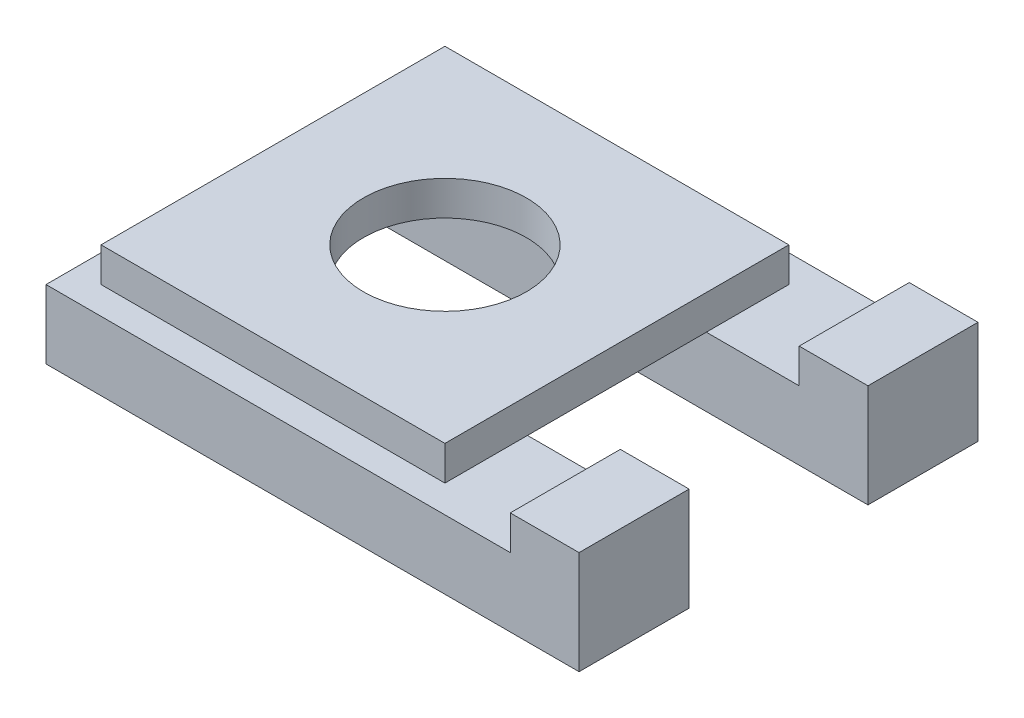
ISO-10303-21;
HEADER;
FILE_DESCRIPTION(('STEP AP214'),'2;1');
FILE_NAME('part.step','',(''),(''),'','','');
FILE_SCHEMA(('AUTOMOTIVE_DESIGN { 1 0 10303 214 1 1 1 1 }'));
ENDSEC;
DATA;
#1=APPLICATION_CONTEXT('core data for automotive mechanical design processes');
#2=APPLICATION_PROTOCOL_DEFINITION('international standard','automotive_design',2000,#1);
#3=PRODUCT_CONTEXT('',#1,'mechanical');
#4=PRODUCT('Part','Part','',(#3));
#5=PRODUCT_RELATED_PRODUCT_CATEGORY('part','',(#4));
#6=PRODUCT_DEFINITION_FORMATION('','',#4);
#7=PRODUCT_DEFINITION_CONTEXT('part definition',#1,'design');
#8=PRODUCT_DEFINITION('design','',#6,#7);
#9=PRODUCT_DEFINITION_SHAPE('','',#8);
#10=(LENGTH_UNIT() NAMED_UNIT(*) SI_UNIT(.MILLI.,.METRE.));
#11=(NAMED_UNIT(*) PLANE_ANGLE_UNIT() SI_UNIT($,.RADIAN.));
#12=(NAMED_UNIT(*) SI_UNIT($,.STERADIAN.) SOLID_ANGLE_UNIT());
#13=UNCERTAINTY_MEASURE_WITH_UNIT(LENGTH_MEASURE(1.E-05),#10,'distance_accuracy_value','');
#14=(GEOMETRIC_REPRESENTATION_CONTEXT(3) GLOBAL_UNCERTAINTY_ASSIGNED_CONTEXT((#13)) GLOBAL_UNIT_ASSIGNED_CONTEXT((#10,
#11,#12)) REPRESENTATION_CONTEXT('',''));
#15=CARTESIAN_POINT('',(0.,0.,0.));
#16=DIRECTION('',(0.,0.,1.));
#17=DIRECTION('',(1.,0.,0.));
#18=AXIS2_PLACEMENT_3D('',#15,#16,#17);
#19=CARTESIAN_POINT('',(0.,0.,0.));
#20=DIRECTION('',(0.,-1.,0.));
#21=DIRECTION('',(0.,0.,-1.));
#22=AXIS2_PLACEMENT_3D('',#19,#20,#21);
#23=PLANE('',#22);
#24=DIRECTION('',(1.,0.,0.));
#25=VECTOR('',#24,1.);
#26=CARTESIAN_POINT('',(0.,0.,26.));
#27=LINE('',#26,#25);
#28=CARTESIAN_POINT('',(-50.,0.,26.));
#29=VERTEX_POINT('',#28);
#30=CARTESIAN_POINT('',(50.,0.,26.));
#31=VERTEX_POINT('',#30);
#32=EDGE_CURVE('E11',#29,#31,#27,.T.);
#33=ORIENTED_EDGE('',*,*,#32,.F.);
#34=DIRECTION('',(0.,0.,1.));
#35=VECTOR('',#34,1.);
#36=CARTESIAN_POINT('',(-50.,0.,50.));
#37=LINE('',#36,#35);
#38=CARTESIAN_POINT('',(-50.,0.,-26.));
#39=VERTEX_POINT('',#38);
#40=EDGE_CURVE('E302',#39,#29,#37,.T.);
#41=ORIENTED_EDGE('',*,*,#40,.F.);
#42=DIRECTION('',(1.,0.,0.));
#43=VECTOR('',#42,1.);
#44=CARTESIAN_POINT('',(0.,0.,-26.));
#45=LINE('',#44,#43);
#46=CARTESIAN_POINT('',(50.,0.,-26.));
#47=VERTEX_POINT('',#46);
#48=EDGE_CURVE('E48',#39,#47,#45,.T.);
#49=ORIENTED_EDGE('',*,*,#48,.T.);
#50=DIRECTION('',(0.,0.,-1.));
#51=VECTOR('',#50,1.);
#52=CARTESIAN_POINT('',(50.,0.,50.));
#53=LINE('',#52,#51);
#54=EDGE_CURVE('E294',#31,#47,#53,.T.);
#55=ORIENTED_EDGE('',*,*,#54,.F.);
#56=EDGE_LOOP('',(#33,#41,#49,#55));
#57=FACE_BOUND('',#56,.T.);
#58=CARTESIAN_POINT('',(0.,0.,0.));
#59=DIRECTION('',(0.,1.,0.));
#60=DIRECTION('',(0.,0.,1.));
#61=AXIS2_PLACEMENT_3D('',#58,#59,#60);
#62=CIRCLE('',#61,23.6820870143645);
#63=CARTESIAN_POINT('',(0.,0.,23.6820870143645));
#64=VERTEX_POINT('',#63);
#65=EDGE_CURVE('E260',#64,#64,#62,.T.);
#66=ORIENTED_EDGE('',*,*,#65,.T.);
#67=EDGE_LOOP('',(#66));
#68=FACE_BOUND('',#67,.T.);
#69=ADVANCED_FACE('F39',(#57,#68),#23,.T.);
#70=CARTESIAN_POINT('',(0.,10.,0.));
#71=DIRECTION('',(0.,-1.,0.));
#72=DIRECTION('',(0.,0.,-1.));
#73=AXIS2_PLACEMENT_3D('',#70,#71,#72);
#74=PLANE('',#73);
#75=DIRECTION('',(0.,0.,-1.));
#76=VECTOR('',#75,1.);
#77=CARTESIAN_POINT('',(50.,10.,50.));
#78=LINE('',#77,#76);
#79=CARTESIAN_POINT('',(50.,10.,50.));
#80=VERTEX_POINT('',#79);
#81=CARTESIAN_POINT('',(50.,10.,-50.));
#82=VERTEX_POINT('',#81);
#83=EDGE_CURVE('E278',#80,#82,#78,.T.);
#84=ORIENTED_EDGE('',*,*,#83,.T.);
#85=DIRECTION('',(-1.,0.,0.));
#86=VECTOR('',#85,1.);
#87=CARTESIAN_POINT('',(-50.,10.,-50.));
#88=LINE('',#87,#86);
#89=CARTESIAN_POINT('',(-50.,10.,-50.));
#90=VERTEX_POINT('',#89);
#91=EDGE_CURVE('E284',#82,#90,#88,.T.);
#92=ORIENTED_EDGE('',*,*,#91,.T.);
#93=DIRECTION('',(0.,0.,1.));
#94=VECTOR('',#93,1.);
#95=CARTESIAN_POINT('',(-50.,10.,50.));
#96=LINE('',#95,#94);
#97=CARTESIAN_POINT('',(-50.,10.,50.));
#98=VERTEX_POINT('',#97);
#99=EDGE_CURVE('E287',#90,#98,#96,.T.);
#100=ORIENTED_EDGE('',*,*,#99,.T.);
#101=DIRECTION('',(1.,0.,0.));
#102=VECTOR('',#101,1.);
#103=CARTESIAN_POINT('',(-50.,10.,50.));
#104=LINE('',#103,#102);
#105=EDGE_CURVE('E289',#98,#80,#104,.T.);
#106=ORIENTED_EDGE('',*,*,#105,.T.);
#107=EDGE_LOOP('',(#84,#92,#100,#106));
#108=FACE_BOUND('',#107,.T.);
#109=CARTESIAN_POINT('',(0.,10.,0.));
#110=DIRECTION('',(0.,1.,0.));
#111=DIRECTION('',(0.,0.,1.));
#112=AXIS2_PLACEMENT_3D('',#109,#110,#111);
#113=CIRCLE('',#112,23.6820870143645);
#114=CARTESIAN_POINT('',(0.,10.,23.6820870143645));
#115=VERTEX_POINT('',#114);
#116=EDGE_CURVE('E273',#115,#115,#113,.T.);
#117=ORIENTED_EDGE('',*,*,#116,.F.);
#118=EDGE_LOOP('',(#117));
#119=FACE_BOUND('',#118,.T.);
#120=ADVANCED_FACE('F340',(#108,#119),#74,.F.);
#121=CARTESIAN_POINT('',(50.,10.,50.));
#122=DIRECTION('',(-1.,0.,0.));
#123=DIRECTION('',(0.,0.,1.));
#124=AXIS2_PLACEMENT_3D('',#121,#122,#123);
#125=PLANE('',#124);
#126=CARTESIAN_POINT('',(50.,0.,50.));
#127=VERTEX_POINT('',#126);
#128=EDGE_CURVE('E292',#127,#31,#53,.T.);
#129=ORIENTED_EDGE('',*,*,#128,.T.);
#130=ORIENTED_EDGE('',*,*,#54,.T.);
#131=CARTESIAN_POINT('',(50.,0.,-50.));
#132=VERTEX_POINT('',#131);
#133=EDGE_CURVE('E280',#47,#132,#53,.T.);
#134=ORIENTED_EDGE('',*,*,#133,.T.);
#135=DIRECTION('',(0.,-1.,0.));
#136=VECTOR('',#135,1.);
#137=CARTESIAN_POINT('',(50.,10.,-50.));
#138=LINE('',#137,#136);
#139=EDGE_CURVE('E43',#82,#132,#138,.T.);
#140=ORIENTED_EDGE('',*,*,#139,.F.);
#141=ORIENTED_EDGE('',*,*,#83,.F.);
#142=DIRECTION('',(0.,-1.,0.));
#143=VECTOR('',#142,1.);
#144=CARTESIAN_POINT('',(50.,10.,50.));
#145=LINE('',#144,#143);
#146=EDGE_CURVE('E288',#80,#127,#145,.T.);
#147=ORIENTED_EDGE('',*,*,#146,.T.);
#148=EDGE_LOOP('',(#129,#130,#134,#140,#141,#147));
#149=FACE_BOUND('',#148,.T.);
#150=ADVANCED_FACE('F41',(#149),#125,.F.);
#151=CARTESIAN_POINT('',(-50.,10.,-50.));
#152=DIRECTION('',(0.,0.,1.));
#153=DIRECTION('',(1.,0.,0.));
#154=AXIS2_PLACEMENT_3D('',#151,#152,#153);
#155=PLANE('',#154);
#156=DIRECTION('',(-1.,0.,0.));
#157=VECTOR('',#156,1.);
#158=CARTESIAN_POINT('',(-50.,0.,-50.));
#159=LINE('',#158,#157);
#160=CARTESIAN_POINT('',(-50.,0.,-50.));
#161=VERTEX_POINT('',#160);
#162=EDGE_CURVE('E291',#132,#161,#159,.T.);
#163=ORIENTED_EDGE('',*,*,#162,.T.);
#164=DIRECTION('',(0.,-1.,0.));
#165=VECTOR('',#164,1.);
#166=CARTESIAN_POINT('',(-50.,10.,-50.));
#167=LINE('',#166,#165);
#168=EDGE_CURVE('E307',#90,#161,#167,.T.);
#169=ORIENTED_EDGE('',*,*,#168,.F.);
#170=ORIENTED_EDGE('',*,*,#91,.F.);
#171=ORIENTED_EDGE('',*,*,#139,.T.);
#172=EDGE_LOOP('',(#163,#169,#170,#171));
#173=FACE_BOUND('',#172,.T.);
#174=ADVANCED_FACE('F357',(#173),#155,.F.);
#175=CARTESIAN_POINT('',(-50.,10.,50.));
#176=DIRECTION('',(1.,0.,0.));
#177=DIRECTION('',(0.,0.,-1.));
#178=AXIS2_PLACEMENT_3D('',#175,#176,#177);
#179=PLANE('',#178);
#180=EDGE_CURVE('E299',#161,#39,#37,.T.);
#181=ORIENTED_EDGE('',*,*,#180,.T.);
#182=ORIENTED_EDGE('',*,*,#40,.T.);
#183=CARTESIAN_POINT('',(-50.,0.,50.));
#184=VERTEX_POINT('',#183);
#185=EDGE_CURVE('E300',#29,#184,#37,.T.);
#186=ORIENTED_EDGE('',*,*,#185,.T.);
#187=DIRECTION('',(0.,-1.,0.));
#188=VECTOR('',#187,1.);
#189=CARTESIAN_POINT('',(-50.,10.,50.));
#190=LINE('',#189,#188);
#191=EDGE_CURVE('E303',#98,#184,#190,.T.);
#192=ORIENTED_EDGE('',*,*,#191,.F.);
#193=ORIENTED_EDGE('',*,*,#99,.F.);
#194=ORIENTED_EDGE('',*,*,#168,.T.);
#195=EDGE_LOOP('',(#181,#182,#186,#192,#193,#194));
#196=FACE_BOUND('',#195,.T.);
#197=ADVANCED_FACE('F354',(#196),#179,.F.);
#198=CARTESIAN_POINT('',(-50.,10.,50.));
#199=DIRECTION('',(0.,0.,-1.));
#200=DIRECTION('',(-1.,0.,0.));
#201=AXIS2_PLACEMENT_3D('',#198,#199,#200);
#202=PLANE('',#201);
#203=DIRECTION('',(1.,0.,0.));
#204=VECTOR('',#203,1.);
#205=CARTESIAN_POINT('',(-50.,0.,50.));
#206=LINE('',#205,#204);
#207=EDGE_CURVE('E281',#184,#127,#206,.T.);
#208=ORIENTED_EDGE('',*,*,#207,.T.);
#209=ORIENTED_EDGE('',*,*,#146,.F.);
#210=ORIENTED_EDGE('',*,*,#105,.F.);
#211=ORIENTED_EDGE('',*,*,#191,.T.);
#212=EDGE_LOOP('',(#208,#209,#210,#211));
#213=FACE_BOUND('',#212,.T.);
#214=ADVANCED_FACE('F349',(#213),#202,.F.);
#215=CARTESIAN_POINT('',(0.,10.,0.));
#216=DIRECTION('',(0.,-1.,0.));
#217=DIRECTION('',(0.,0.,-1.));
#218=AXIS2_PLACEMENT_3D('',#215,#216,#217);
#219=CYLINDRICAL_SURFACE('',#218,23.6820870143645);
#220=ORIENTED_EDGE('',*,*,#116,.T.);
#221=EDGE_LOOP('',(#220));
#222=FACE_BOUND('',#221,.T.);
#223=ORIENTED_EDGE('',*,*,#65,.F.);
#224=EDGE_LOOP('',(#223));
#225=FACE_BOUND('',#224,.T.);
#226=ADVANCED_FACE('F355',(#222,#225),#219,.F.);
#227=CARTESIAN_POINT('',(0.,-20.,-26.));
#228=DIRECTION('',(0.,0.,1.));
#229=DIRECTION('',(1.,0.,0.));
#230=AXIS2_PLACEMENT_3D('',#227,#228,#229);
#231=PLANE('',#230);
#232=CARTESIAN_POINT('',(-58.,0.,-26.));
#233=VERTEX_POINT('',#232);
#234=EDGE_CURVE('E265',#233,#39,#45,.T.);
#235=ORIENTED_EDGE('',*,*,#234,.F.);
#236=DIRECTION('',(0.,1.,0.));
#237=VECTOR('',#236,1.);
#238=CARTESIAN_POINT('',(-58.,-20.,-26.));
#239=LINE('',#238,#237);
#240=CARTESIAN_POINT('',(-58.,-20.,-26.));
#241=VERTEX_POINT('',#240);
#242=EDGE_CURVE('E243',#241,#233,#239,.T.);
#243=ORIENTED_EDGE('',*,*,#242,.F.);
#244=DIRECTION('',(1.,0.,0.));
#245=VECTOR('',#244,1.);
#246=CARTESIAN_POINT('',(0.,-20.,-26.));
#247=LINE('',#246,#245);
#248=CARTESIAN_POINT('',(97.,-20.,-26.));
#249=VERTEX_POINT('',#248);
#250=EDGE_CURVE('E256',#241,#249,#247,.T.);
#251=ORIENTED_EDGE('',*,*,#250,.T.);
#252=DIRECTION('',(0.,-1.,0.));
#253=VECTOR('',#252,1.);
#254=CARTESIAN_POINT('',(97.,10.,-26.));
#255=LINE('',#254,#253);
#256=CARTESIAN_POINT('',(97.,10.,-26.));
#257=VERTEX_POINT('',#256);
#258=EDGE_CURVE('E189',#257,#249,#255,.T.);
#259=ORIENTED_EDGE('',*,*,#258,.F.);
#260=DIRECTION('',(1.,0.,0.));
#261=VECTOR('',#260,1.);
#262=CARTESIAN_POINT('',(0.,10.,-26.));
#263=LINE('',#262,#261);
#264=CARTESIAN_POINT('',(77.,10.,-26.));
#265=VERTEX_POINT('',#264);
#266=EDGE_CURVE('E206',#265,#257,#263,.T.);
#267=ORIENTED_EDGE('',*,*,#266,.F.);
#268=DIRECTION('',(0.,-1.,0.));
#269=VECTOR('',#268,1.);
#270=CARTESIAN_POINT('',(77.,10.,-26.));
#271=LINE('',#270,#269);
#272=CARTESIAN_POINT('',(77.,0.,-26.));
#273=VERTEX_POINT('',#272);
#274=EDGE_CURVE('E208',#265,#273,#271,.T.);
#275=ORIENTED_EDGE('',*,*,#274,.T.);
#276=EDGE_CURVE('E61',#47,#273,#45,.T.);
#277=ORIENTED_EDGE('',*,*,#276,.F.);
#278=ORIENTED_EDGE('',*,*,#48,.F.);
#279=EDGE_LOOP('',(#235,#243,#251,#259,#267,#275,#277,#278));
#280=FACE_BOUND('',#279,.T.);
#281=ADVANCED_FACE('F330',(#280),#231,.T.);
#282=CARTESIAN_POINT('',(-58.,-20.,0.));
#283=DIRECTION('',(-1.,0.,0.));
#284=DIRECTION('',(0.,0.,1.));
#285=AXIS2_PLACEMENT_3D('',#282,#283,#284);
#286=PLANE('',#285);
#287=DIRECTION('',(0.,0.,1.));
#288=VECTOR('',#287,1.);
#289=CARTESIAN_POINT('',(-58.,0.,0.));
#290=LINE('',#289,#288);
#291=CARTESIAN_POINT('',(-58.,0.,-58.));
#292=VERTEX_POINT('',#291);
#293=EDGE_CURVE('E264',#292,#233,#290,.T.);
#294=ORIENTED_EDGE('',*,*,#293,.F.);
#295=DIRECTION('',(0.,1.,0.));
#296=VECTOR('',#295,1.);
#297=CARTESIAN_POINT('',(-58.,-20.,-58.));
#298=LINE('',#297,#296);
#299=CARTESIAN_POINT('',(-58.,-20.,-58.));
#300=VERTEX_POINT('',#299);
#301=EDGE_CURVE('E179',#300,#292,#298,.T.);
#302=ORIENTED_EDGE('',*,*,#301,.F.);
#303=DIRECTION('',(0.,0.,1.));
#304=VECTOR('',#303,1.);
#305=CARTESIAN_POINT('',(-58.,-20.,0.));
#306=LINE('',#305,#304);
#307=EDGE_CURVE('E177',#300,#241,#306,.T.);
#308=ORIENTED_EDGE('',*,*,#307,.T.);
#309=ORIENTED_EDGE('',*,*,#242,.T.);
#310=EDGE_LOOP('',(#294,#302,#308,#309));
#311=FACE_BOUND('',#310,.T.);
#312=ADVANCED_FACE('F384',(#311),#286,.T.);
#313=CARTESIAN_POINT('',(0.,-20.,-58.));
#314=DIRECTION('',(0.,0.,1.));
#315=DIRECTION('',(1.,0.,0.));
#316=AXIS2_PLACEMENT_3D('',#313,#314,#315);
#317=PLANE('',#316);
#318=DIRECTION('',(1.,0.,0.));
#319=VECTOR('',#318,1.);
#320=CARTESIAN_POINT('',(0.,0.,-58.));
#321=LINE('',#320,#319);
#322=CARTESIAN_POINT('',(77.,0.,-58.));
#323=VERTEX_POINT('',#322);
#324=EDGE_CURVE('E268',#292,#323,#321,.T.);
#325=ORIENTED_EDGE('',*,*,#324,.T.);
#326=DIRECTION('',(0.,-1.,0.));
#327=VECTOR('',#326,1.);
#328=CARTESIAN_POINT('',(77.,10.,-58.));
#329=LINE('',#328,#327);
#330=CARTESIAN_POINT('',(77.,10.,-58.));
#331=VERTEX_POINT('',#330);
#332=EDGE_CURVE('E186',#331,#323,#329,.T.);
#333=ORIENTED_EDGE('',*,*,#332,.F.);
#334=DIRECTION('',(1.,0.,0.));
#335=VECTOR('',#334,1.);
#336=CARTESIAN_POINT('',(0.,10.,-58.));
#337=LINE('',#336,#335);
#338=CARTESIAN_POINT('',(97.,10.,-58.));
#339=VERTEX_POINT('',#338);
#340=EDGE_CURVE('E184',#331,#339,#337,.T.);
#341=ORIENTED_EDGE('',*,*,#340,.T.);
#342=DIRECTION('',(0.,-1.,0.));
#343=VECTOR('',#342,1.);
#344=CARTESIAN_POINT('',(97.,10.,-58.));
#345=LINE('',#344,#343);
#346=CARTESIAN_POINT('',(97.,-20.,-58.));
#347=VERTEX_POINT('',#346);
#348=EDGE_CURVE('E182',#339,#347,#345,.T.);
#349=ORIENTED_EDGE('',*,*,#348,.T.);
#350=DIRECTION('',(1.,0.,0.));
#351=VECTOR('',#350,1.);
#352=CARTESIAN_POINT('',(0.,-20.,-58.));
#353=LINE('',#352,#351);
#354=EDGE_CURVE('E166',#300,#347,#353,.T.);
#355=ORIENTED_EDGE('',*,*,#354,.F.);
#356=ORIENTED_EDGE('',*,*,#301,.T.);
#357=EDGE_LOOP('',(#325,#333,#341,#349,#355,#356));
#358=FACE_BOUND('',#357,.T.);
#359=ADVANCED_FACE('F185',(#358),#317,.F.);
#360=CARTESIAN_POINT('',(0.,-20.,0.));
#361=DIRECTION('',(0.,-1.,0.));
#362=DIRECTION('',(0.,0.,-1.));
#363=AXIS2_PLACEMENT_3D('',#360,#361,#362);
#364=PLANE('',#363);
#365=ORIENTED_EDGE('',*,*,#250,.F.);
#366=ORIENTED_EDGE('',*,*,#307,.F.);
#367=ORIENTED_EDGE('',*,*,#354,.T.);
#368=DIRECTION('',(0.,0.,1.));
#369=VECTOR('',#368,1.);
#370=CARTESIAN_POINT('',(97.,-20.,0.));
#371=LINE('',#370,#369);
#372=EDGE_CURVE('E171',#347,#249,#371,.T.);
#373=ORIENTED_EDGE('',*,*,#372,.T.);
#374=EDGE_LOOP('',(#365,#366,#367,#373));
#375=FACE_BOUND('',#374,.T.);
#376=ADVANCED_FACE('F175',(#375),#364,.T.);
#377=CARTESIAN_POINT('',(0.,0.,0.));
#378=DIRECTION('',(0.,-1.,0.));
#379=DIRECTION('',(0.,0.,-1.));
#380=AXIS2_PLACEMENT_3D('',#377,#378,#379);
#381=PLANE('',#380);
#382=ORIENTED_EDGE('',*,*,#133,.F.);
#383=ORIENTED_EDGE('',*,*,#276,.T.);
#384=DIRECTION('',(0.,0.,1.));
#385=VECTOR('',#384,1.);
#386=CARTESIAN_POINT('',(77.,0.,0.));
#387=LINE('',#386,#385);
#388=EDGE_CURVE('E257',#323,#273,#387,.T.);
#389=ORIENTED_EDGE('',*,*,#388,.F.);
#390=ORIENTED_EDGE('',*,*,#324,.F.);
#391=ORIENTED_EDGE('',*,*,#293,.T.);
#392=ORIENTED_EDGE('',*,*,#234,.T.);
#393=ORIENTED_EDGE('',*,*,#180,.F.);
#394=ORIENTED_EDGE('',*,*,#162,.F.);
#395=EDGE_LOOP('',(#382,#383,#389,#390,#391,#392,#393,#394));
#396=FACE_BOUND('',#395,.T.);
#397=ADVANCED_FACE('F317',(#396),#381,.F.);
#398=CARTESIAN_POINT('',(-58.,-20.,0.));
#399=DIRECTION('',(1.,0.,0.));
#400=DIRECTION('',(0.,0.,-1.));
#401=AXIS2_PLACEMENT_3D('',#398,#399,#400);
#402=PLANE('',#401);
#403=DIRECTION('',(0.,0.,-1.));
#404=VECTOR('',#403,1.);
#405=CARTESIAN_POINT('',(-58.,0.,0.));
#406=LINE('',#405,#404);
#407=CARTESIAN_POINT('',(-58.,0.,58.));
#408=VERTEX_POINT('',#407);
#409=CARTESIAN_POINT('',(-58.,0.,26.));
#410=VERTEX_POINT('',#409);
#411=EDGE_CURVE('E244',#408,#410,#406,.T.);
#412=ORIENTED_EDGE('',*,*,#411,.T.);
#413=DIRECTION('',(0.,1.,0.));
#414=VECTOR('',#413,1.);
#415=CARTESIAN_POINT('',(-58.,-20.,26.));
#416=LINE('',#415,#414);
#417=CARTESIAN_POINT('',(-58.,-20.,26.));
#418=VERTEX_POINT('',#417);
#419=EDGE_CURVE('E255',#418,#410,#416,.T.);
#420=ORIENTED_EDGE('',*,*,#419,.F.);
#421=DIRECTION('',(0.,0.,-1.));
#422=VECTOR('',#421,1.);
#423=CARTESIAN_POINT('',(-58.,-20.,0.));
#424=LINE('',#423,#422);
#425=CARTESIAN_POINT('',(-58.,-20.,58.));
#426=VERTEX_POINT('',#425);
#427=EDGE_CURVE('E231',#426,#418,#424,.T.);
#428=ORIENTED_EDGE('',*,*,#427,.F.);
#429=DIRECTION('',(0.,1.,0.));
#430=VECTOR('',#429,1.);
#431=CARTESIAN_POINT('',(-58.,-20.,58.));
#432=LINE('',#431,#430);
#433=EDGE_CURVE('E245',#426,#408,#432,.T.);
#434=ORIENTED_EDGE('',*,*,#433,.T.);
#435=EDGE_LOOP('',(#412,#420,#428,#434));
#436=FACE_BOUND('',#435,.T.);
#437=ADVANCED_FACE('F393',(#436),#402,.F.);
#438=CARTESIAN_POINT('',(0.,-20.,26.));
#439=DIRECTION('',(0.,0.,1.));
#440=DIRECTION('',(1.,0.,0.));
#441=AXIS2_PLACEMENT_3D('',#438,#439,#440);
#442=PLANE('',#441);
#443=EDGE_CURVE('E49',#410,#29,#27,.T.);
#444=ORIENTED_EDGE('',*,*,#443,.T.);
#445=ORIENTED_EDGE('',*,*,#32,.T.);
#446=CARTESIAN_POINT('',(77.,0.,26.));
#447=VERTEX_POINT('',#446);
#448=EDGE_CURVE('E51',#31,#447,#27,.T.);
#449=ORIENTED_EDGE('',*,*,#448,.T.);
#450=DIRECTION('',(0.,-1.,0.));
#451=VECTOR('',#450,1.);
#452=CARTESIAN_POINT('',(77.,10.,26.));
#453=LINE('',#452,#451);
#454=CARTESIAN_POINT('',(77.,10.,26.));
#455=VERTEX_POINT('',#454);
#456=EDGE_CURVE('E228',#455,#447,#453,.T.);
#457=ORIENTED_EDGE('',*,*,#456,.F.);
#458=DIRECTION('',(1.,0.,0.));
#459=VECTOR('',#458,1.);
#460=CARTESIAN_POINT('',(0.,10.,26.));
#461=LINE('',#460,#459);
#462=CARTESIAN_POINT('',(97.,10.,26.));
#463=VERTEX_POINT('',#462);
#464=EDGE_CURVE('E225',#455,#463,#461,.T.);
#465=ORIENTED_EDGE('',*,*,#464,.T.);
#466=DIRECTION('',(0.,-1.,0.));
#467=VECTOR('',#466,1.);
#468=CARTESIAN_POINT('',(97.,10.,26.));
#469=LINE('',#468,#467);
#470=CARTESIAN_POINT('',(97.,-20.,26.));
#471=VERTEX_POINT('',#470);
#472=EDGE_CURVE('E199',#463,#471,#469,.T.);
#473=ORIENTED_EDGE('',*,*,#472,.T.);
#474=DIRECTION('',(1.,0.,0.));
#475=VECTOR('',#474,1.);
#476=CARTESIAN_POINT('',(0.,-20.,26.));
#477=LINE('',#476,#475);
#478=EDGE_CURVE('E240',#418,#471,#477,.T.);
#479=ORIENTED_EDGE('',*,*,#478,.F.);
#480=ORIENTED_EDGE('',*,*,#419,.T.);
#481=EDGE_LOOP('',(#444,#445,#449,#457,#465,#473,#479,#480));
#482=FACE_BOUND('',#481,.T.);
#483=ADVANCED_FACE('F369',(#482),#442,.F.);
#484=CARTESIAN_POINT('',(0.,-20.,58.));
#485=DIRECTION('',(0.,0.,1.));
#486=DIRECTION('',(1.,0.,0.));
#487=AXIS2_PLACEMENT_3D('',#484,#485,#486);
#488=PLANE('',#487);
#489=DIRECTION('',(1.,0.,0.));
#490=VECTOR('',#489,1.);
#491=CARTESIAN_POINT('',(0.,0.,58.));
#492=LINE('',#491,#490);
#493=CARTESIAN_POINT('',(77.,0.,58.));
#494=VERTEX_POINT('',#493);
#495=EDGE_CURVE('E236',#408,#494,#492,.T.);
#496=ORIENTED_EDGE('',*,*,#495,.F.);
#497=ORIENTED_EDGE('',*,*,#433,.F.);
#498=DIRECTION('',(1.,0.,0.));
#499=VECTOR('',#498,1.);
#500=CARTESIAN_POINT('',(0.,-20.,58.));
#501=LINE('',#500,#499);
#502=CARTESIAN_POINT('',(97.,-20.,58.));
#503=VERTEX_POINT('',#502);
#504=EDGE_CURVE('E238',#426,#503,#501,.T.);
#505=ORIENTED_EDGE('',*,*,#504,.T.);
#506=DIRECTION('',(0.,-1.,0.));
#507=VECTOR('',#506,1.);
#508=CARTESIAN_POINT('',(97.,10.,58.));
#509=LINE('',#508,#507);
#510=CARTESIAN_POINT('',(97.,10.,58.));
#511=VERTEX_POINT('',#510);
#512=EDGE_CURVE('E193',#511,#503,#509,.T.);
#513=ORIENTED_EDGE('',*,*,#512,.F.);
#514=DIRECTION('',(1.,0.,0.));
#515=VECTOR('',#514,1.);
#516=CARTESIAN_POINT('',(0.,10.,58.));
#517=LINE('',#516,#515);
#518=CARTESIAN_POINT('',(77.,10.,58.));
#519=VERTEX_POINT('',#518);
#520=EDGE_CURVE('E216',#519,#511,#517,.T.);
#521=ORIENTED_EDGE('',*,*,#520,.F.);
#522=DIRECTION('',(0.,-1.,0.));
#523=VECTOR('',#522,1.);
#524=CARTESIAN_POINT('',(77.,10.,58.));
#525=LINE('',#524,#523);
#526=EDGE_CURVE('E227',#519,#494,#525,.T.);
#527=ORIENTED_EDGE('',*,*,#526,.T.);
#528=EDGE_LOOP('',(#496,#497,#505,#513,#521,#527));
#529=FACE_BOUND('',#528,.T.);
#530=ADVANCED_FACE('F401',(#529),#488,.T.);
#531=CARTESIAN_POINT('',(0.,-20.,0.));
#532=DIRECTION('',(0.,-1.,0.));
#533=DIRECTION('',(0.,0.,-1.));
#534=AXIS2_PLACEMENT_3D('',#531,#532,#533);
#535=PLANE('',#534);
#536=ORIENTED_EDGE('',*,*,#427,.T.);
#537=ORIENTED_EDGE('',*,*,#478,.T.);
#538=DIRECTION('',(0.,0.,-1.));
#539=VECTOR('',#538,1.);
#540=CARTESIAN_POINT('',(97.,-20.,0.));
#541=LINE('',#540,#539);
#542=EDGE_CURVE('E213',#503,#471,#541,.T.);
#543=ORIENTED_EDGE('',*,*,#542,.F.);
#544=ORIENTED_EDGE('',*,*,#504,.F.);
#545=EDGE_LOOP('',(#536,#537,#543,#544));
#546=FACE_BOUND('',#545,.T.);
#547=ADVANCED_FACE('F407',(#546),#535,.T.);
#548=CARTESIAN_POINT('',(0.,0.,0.));
#549=DIRECTION('',(0.,-1.,0.));
#550=DIRECTION('',(0.,0.,-1.));
#551=AXIS2_PLACEMENT_3D('',#548,#549,#550);
#552=PLANE('',#551);
#553=ORIENTED_EDGE('',*,*,#128,.F.);
#554=ORIENTED_EDGE('',*,*,#207,.F.);
#555=ORIENTED_EDGE('',*,*,#185,.F.);
#556=ORIENTED_EDGE('',*,*,#443,.F.);
#557=ORIENTED_EDGE('',*,*,#411,.F.);
#558=ORIENTED_EDGE('',*,*,#495,.T.);
#559=DIRECTION('',(0.,0.,-1.));
#560=VECTOR('',#559,1.);
#561=CARTESIAN_POINT('',(77.,0.,0.));
#562=LINE('',#561,#560);
#563=EDGE_CURVE('E249',#494,#447,#562,.T.);
#564=ORIENTED_EDGE('',*,*,#563,.T.);
#565=ORIENTED_EDGE('',*,*,#448,.F.);
#566=EDGE_LOOP('',(#553,#554,#555,#556,#557,#558,#564,#565));
#567=FACE_BOUND('',#566,.T.);
#568=ADVANCED_FACE('F368',(#567),#552,.F.);
#569=CARTESIAN_POINT('',(77.,10.,0.));
#570=DIRECTION('',(-1.,0.,0.));
#571=DIRECTION('',(0.,0.,1.));
#572=AXIS2_PLACEMENT_3D('',#569,#570,#571);
#573=PLANE('',#572);
#574=ORIENTED_EDGE('',*,*,#563,.F.);
#575=ORIENTED_EDGE('',*,*,#526,.F.);
#576=DIRECTION('',(0.,0.,-1.));
#577=VECTOR('',#576,1.);
#578=CARTESIAN_POINT('',(77.,10.,0.));
#579=LINE('',#578,#577);
#580=EDGE_CURVE('E218',#519,#455,#579,.T.);
#581=ORIENTED_EDGE('',*,*,#580,.T.);
#582=ORIENTED_EDGE('',*,*,#456,.T.);
#583=EDGE_LOOP('',(#574,#575,#581,#582));
#584=FACE_BOUND('',#583,.T.);
#585=ADVANCED_FACE('F408',(#584),#573,.T.);
#586=CARTESIAN_POINT('',(97.,10.,0.));
#587=DIRECTION('',(-1.,0.,0.));
#588=DIRECTION('',(0.,0.,1.));
#589=AXIS2_PLACEMENT_3D('',#586,#587,#588);
#590=PLANE('',#589);
#591=ORIENTED_EDGE('',*,*,#512,.T.);
#592=ORIENTED_EDGE('',*,*,#542,.T.);
#593=ORIENTED_EDGE('',*,*,#472,.F.);
#594=DIRECTION('',(0.,0.,-1.));
#595=VECTOR('',#594,1.);
#596=CARTESIAN_POINT('',(97.,10.,0.));
#597=LINE('',#596,#595);
#598=EDGE_CURVE('E223',#511,#463,#597,.T.);
#599=ORIENTED_EDGE('',*,*,#598,.F.);
#600=EDGE_LOOP('',(#591,#592,#593,#599));
#601=FACE_BOUND('',#600,.T.);
#602=ADVANCED_FACE('F418',(#601),#590,.F.);
#603=CARTESIAN_POINT('',(0.,10.,0.));
#604=DIRECTION('',(0.,-1.,0.));
#605=DIRECTION('',(0.,0.,-1.));
#606=AXIS2_PLACEMENT_3D('',#603,#604,#605);
#607=PLANE('',#606);
#608=ORIENTED_EDGE('',*,*,#520,.T.);
#609=ORIENTED_EDGE('',*,*,#598,.T.);
#610=ORIENTED_EDGE('',*,*,#464,.F.);
#611=ORIENTED_EDGE('',*,*,#580,.F.);
#612=EDGE_LOOP('',(#608,#609,#610,#611));
#613=FACE_BOUND('',#612,.T.);
#614=ADVANCED_FACE('F419',(#613),#607,.F.);
#615=CARTESIAN_POINT('',(77.,10.,0.));
#616=DIRECTION('',(1.,0.,0.));
#617=DIRECTION('',(0.,0.,-1.));
#618=AXIS2_PLACEMENT_3D('',#615,#616,#617);
#619=PLANE('',#618);
#620=ORIENTED_EDGE('',*,*,#332,.T.);
#621=ORIENTED_EDGE('',*,*,#388,.T.);
#622=ORIENTED_EDGE('',*,*,#274,.F.);
#623=DIRECTION('',(0.,0.,1.));
#624=VECTOR('',#623,1.);
#625=CARTESIAN_POINT('',(77.,10.,0.));
#626=LINE('',#625,#624);
#627=EDGE_CURVE('E191',#331,#265,#626,.T.);
#628=ORIENTED_EDGE('',*,*,#627,.F.);
#629=EDGE_LOOP('',(#620,#621,#622,#628));
#630=FACE_BOUND('',#629,.T.);
#631=ADVANCED_FACE('F322',(#630),#619,.F.);
#632=CARTESIAN_POINT('',(97.,10.,0.));
#633=DIRECTION('',(1.,0.,0.));
#634=DIRECTION('',(0.,0.,-1.));
#635=AXIS2_PLACEMENT_3D('',#632,#633,#634);
#636=PLANE('',#635);
#637=ORIENTED_EDGE('',*,*,#258,.T.);
#638=ORIENTED_EDGE('',*,*,#372,.F.);
#639=ORIENTED_EDGE('',*,*,#348,.F.);
#640=DIRECTION('',(0.,0.,1.));
#641=VECTOR('',#640,1.);
#642=CARTESIAN_POINT('',(97.,10.,0.));
#643=LINE('',#642,#641);
#644=EDGE_CURVE('E204',#339,#257,#643,.T.);
#645=ORIENTED_EDGE('',*,*,#644,.T.);
#646=EDGE_LOOP('',(#637,#638,#639,#645));
#647=FACE_BOUND('',#646,.T.);
#648=ADVANCED_FACE('F195',(#647),#636,.T.);
#649=CARTESIAN_POINT('',(0.,10.,0.));
#650=DIRECTION('',(0.,-1.,0.));
#651=DIRECTION('',(0.,0.,-1.));
#652=AXIS2_PLACEMENT_3D('',#649,#650,#651);
#653=PLANE('',#652);
#654=ORIENTED_EDGE('',*,*,#627,.T.);
#655=ORIENTED_EDGE('',*,*,#266,.T.);
#656=ORIENTED_EDGE('',*,*,#644,.F.);
#657=ORIENTED_EDGE('',*,*,#340,.F.);
#658=EDGE_LOOP('',(#654,#655,#656,#657));
#659=FACE_BOUND('',#658,.T.);
#660=ADVANCED_FACE('F328',(#659),#653,.F.);
#661=CLOSED_SHELL('',(#69,#120,#150,#174,#197,#214,#226,#281,#312,#359,#376,#397,#437,#483,#530,
#547,#568,#585,#602,#614,#631,#648,#660));
#662=MANIFOLD_SOLID_BREP('B2',#661);
#663=ADVANCED_BREP_SHAPE_REPRESENTATION('',(#18,#662),#14);
#664=SHAPE_DEFINITION_REPRESENTATION(#9,#663);
ENDSEC;
END-ISO-10303-21;
